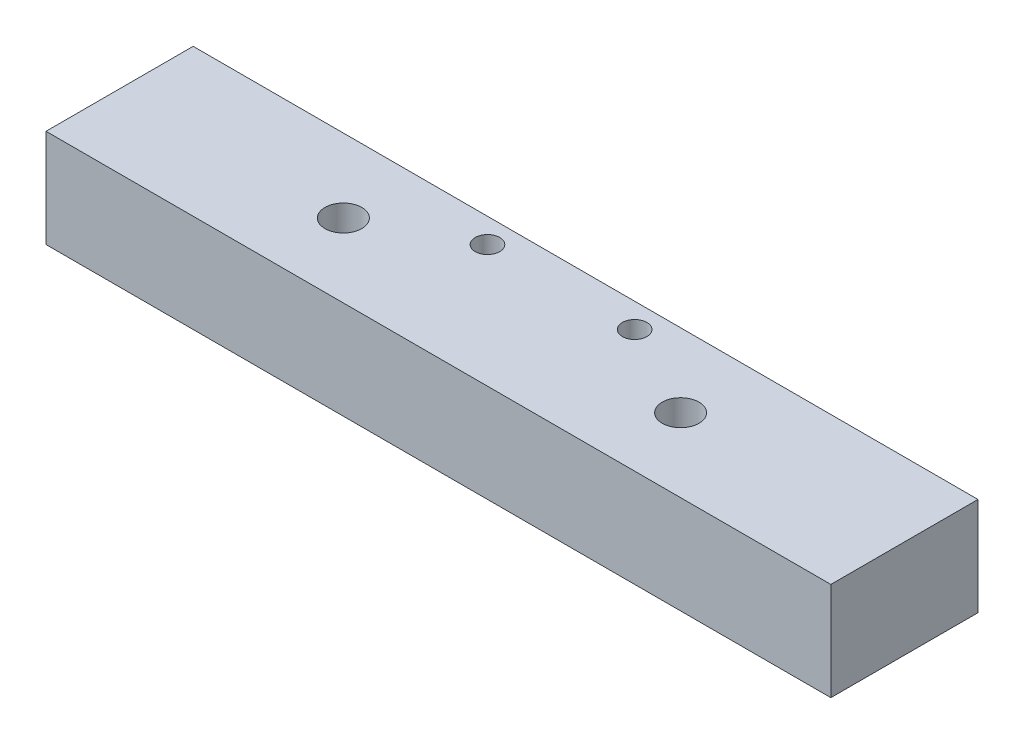
ISO-10303-21;
HEADER;
FILE_DESCRIPTION(('STEP AP214'),'2;1');
FILE_NAME('part.step','',(''),(''),'','','');
FILE_SCHEMA(('AUTOMOTIVE_DESIGN { 1 0 10303 214 1 1 1 1 }'));
ENDSEC;
DATA;
#1=APPLICATION_CONTEXT('core data for automotive mechanical design processes');
#2=APPLICATION_PROTOCOL_DEFINITION('international standard','automotive_design',2000,#1);
#3=PRODUCT_CONTEXT('',#1,'mechanical');
#4=PRODUCT('Part','Part','',(#3));
#5=PRODUCT_RELATED_PRODUCT_CATEGORY('part','',(#4));
#6=PRODUCT_DEFINITION_FORMATION('','',#4);
#7=PRODUCT_DEFINITION_CONTEXT('part definition',#1,'design');
#8=PRODUCT_DEFINITION('design','',#6,#7);
#9=PRODUCT_DEFINITION_SHAPE('','',#8);
#10=(LENGTH_UNIT() NAMED_UNIT(*) SI_UNIT(.MILLI.,.METRE.));
#11=(NAMED_UNIT(*) PLANE_ANGLE_UNIT() SI_UNIT($,.RADIAN.));
#12=(NAMED_UNIT(*) SI_UNIT($,.STERADIAN.) SOLID_ANGLE_UNIT());
#13=UNCERTAINTY_MEASURE_WITH_UNIT(LENGTH_MEASURE(1.E-05),#10,'distance_accuracy_value','');
#14=(GEOMETRIC_REPRESENTATION_CONTEXT(3) GLOBAL_UNCERTAINTY_ASSIGNED_CONTEXT((#13)) GLOBAL_UNIT_ASSIGNED_CONTEXT((#10,
#11,#12)) REPRESENTATION_CONTEXT('',''));
#15=CARTESIAN_POINT('',(0.,0.,0.));
#16=DIRECTION('',(0.,0.,1.));
#17=DIRECTION('',(1.,0.,0.));
#18=AXIS2_PLACEMENT_3D('',#15,#16,#17);
#19=CARTESIAN_POINT('',(203.2,50.8,38.1));
#20=DIRECTION('',(-1.,0.,0.));
#21=DIRECTION('',(0.,0.,1.));
#22=AXIS2_PLACEMENT_3D('',#19,#20,#21);
#23=PLANE('',#22);
#24=DIRECTION('',(0.,0.,-1.));
#25=VECTOR('',#24,1.);
#26=CARTESIAN_POINT('',(203.2,0.,38.1));
#27=LINE('',#26,#25);
#28=CARTESIAN_POINT('',(203.2,0.,38.1));
#29=VERTEX_POINT('',#28);
#30=CARTESIAN_POINT('',(203.2,0.,-38.1));
#31=VERTEX_POINT('',#30);
#32=EDGE_CURVE('E101',#29,#31,#27,.T.);
#33=ORIENTED_EDGE('',*,*,#32,.T.);
#34=DIRECTION('',(0.,-1.,0.));
#35=VECTOR('',#34,1.);
#36=CARTESIAN_POINT('',(203.2,50.8,-38.1));
#37=LINE('',#36,#35);
#38=CARTESIAN_POINT('',(203.2,50.8,-38.1));
#39=VERTEX_POINT('',#38);
#40=EDGE_CURVE('E11',#39,#31,#37,.T.);
#41=ORIENTED_EDGE('',*,*,#40,.F.);
#42=DIRECTION('',(0.,0.,-1.));
#43=VECTOR('',#42,1.);
#44=CARTESIAN_POINT('',(203.2,50.8,38.1));
#45=LINE('',#44,#43);
#46=CARTESIAN_POINT('',(203.2,50.8,38.1));
#47=VERTEX_POINT('',#46);
#48=EDGE_CURVE('E89',#47,#39,#45,.T.);
#49=ORIENTED_EDGE('',*,*,#48,.F.);
#50=DIRECTION('',(0.,-1.,0.));
#51=VECTOR('',#50,1.);
#52=CARTESIAN_POINT('',(203.2,50.8,38.1));
#53=LINE('',#52,#51);
#54=EDGE_CURVE('E97',#47,#29,#53,.T.);
#55=ORIENTED_EDGE('',*,*,#54,.T.);
#56=EDGE_LOOP('',(#33,#41,#49,#55));
#57=FACE_BOUND('',#56,.T.);
#58=ADVANCED_FACE('F38',(#57),#23,.F.);
#59=CARTESIAN_POINT('',(-203.2,50.8,-38.1));
#60=DIRECTION('',(0.,0.,1.));
#61=DIRECTION('',(1.,0.,0.));
#62=AXIS2_PLACEMENT_3D('',#59,#60,#61);
#63=PLANE('',#62);
#64=DIRECTION('',(-1.,0.,0.));
#65=VECTOR('',#64,1.);
#66=CARTESIAN_POINT('',(-203.2,0.,-38.1));
#67=LINE('',#66,#65);
#68=CARTESIAN_POINT('',(-203.2,0.,-38.1));
#69=VERTEX_POINT('',#68);
#70=EDGE_CURVE('E93',#31,#69,#67,.T.);
#71=ORIENTED_EDGE('',*,*,#70,.T.);
#72=DIRECTION('',(0.,-1.,0.));
#73=VECTOR('',#72,1.);
#74=CARTESIAN_POINT('',(-203.2,50.8,-38.1));
#75=LINE('',#74,#73);
#76=CARTESIAN_POINT('',(-203.2,50.8,-38.1));
#77=VERTEX_POINT('',#76);
#78=EDGE_CURVE('E46',#77,#69,#75,.T.);
#79=ORIENTED_EDGE('',*,*,#78,.F.);
#80=DIRECTION('',(-1.,0.,0.));
#81=VECTOR('',#80,1.);
#82=CARTESIAN_POINT('',(-203.2,50.8,-38.1));
#83=LINE('',#82,#81);
#84=EDGE_CURVE('E84',#39,#77,#83,.T.);
#85=ORIENTED_EDGE('',*,*,#84,.F.);
#86=ORIENTED_EDGE('',*,*,#40,.T.);
#87=EDGE_LOOP('',(#71,#79,#85,#86));
#88=FACE_BOUND('',#87,.T.);
#89=ADVANCED_FACE('F92',(#88),#63,.F.);
#90=CARTESIAN_POINT('',(-203.2,50.8,38.1));
#91=DIRECTION('',(1.,0.,0.));
#92=DIRECTION('',(0.,0.,-1.));
#93=AXIS2_PLACEMENT_3D('',#90,#91,#92);
#94=PLANE('',#93);
#95=DIRECTION('',(0.,0.,1.));
#96=VECTOR('',#95,1.);
#97=CARTESIAN_POINT('',(-203.2,0.,38.1));
#98=LINE('',#97,#96);
#99=CARTESIAN_POINT('',(-203.2,0.,38.1));
#100=VERTEX_POINT('',#99);
#101=EDGE_CURVE('E71',#69,#100,#98,.T.);
#102=ORIENTED_EDGE('',*,*,#101,.T.);
#103=DIRECTION('',(0.,-1.,0.));
#104=VECTOR('',#103,1.);
#105=CARTESIAN_POINT('',(-203.2,50.8,38.1));
#106=LINE('',#105,#104);
#107=CARTESIAN_POINT('',(-203.2,50.8,38.1));
#108=VERTEX_POINT('',#107);
#109=EDGE_CURVE('E94',#108,#100,#106,.T.);
#110=ORIENTED_EDGE('',*,*,#109,.F.);
#111=DIRECTION('',(0.,0.,1.));
#112=VECTOR('',#111,1.);
#113=CARTESIAN_POINT('',(-203.2,50.8,38.1));
#114=LINE('',#113,#112);
#115=EDGE_CURVE('E87',#77,#108,#114,.T.);
#116=ORIENTED_EDGE('',*,*,#115,.F.);
#117=ORIENTED_EDGE('',*,*,#78,.T.);
#118=EDGE_LOOP('',(#102,#110,#116,#117));
#119=FACE_BOUND('',#118,.T.);
#120=ADVANCED_FACE('F95',(#119),#94,.F.);
#121=CARTESIAN_POINT('',(-203.2,50.8,38.1));
#122=DIRECTION('',(0.,0.,-1.));
#123=DIRECTION('',(-1.,0.,0.));
#124=AXIS2_PLACEMENT_3D('',#121,#122,#123);
#125=PLANE('',#124);
#126=DIRECTION('',(1.,0.,0.));
#127=VECTOR('',#126,1.);
#128=CARTESIAN_POINT('',(-203.2,0.,38.1));
#129=LINE('',#128,#127);
#130=EDGE_CURVE('E77',#100,#29,#129,.T.);
#131=ORIENTED_EDGE('',*,*,#130,.T.);
#132=ORIENTED_EDGE('',*,*,#54,.F.);
#133=DIRECTION('',(1.,0.,0.));
#134=VECTOR('',#133,1.);
#135=CARTESIAN_POINT('',(-203.2,50.8,38.1));
#136=LINE('',#135,#134);
#137=EDGE_CURVE('E54',#108,#47,#136,.T.);
#138=ORIENTED_EDGE('',*,*,#137,.F.);
#139=ORIENTED_EDGE('',*,*,#109,.T.);
#140=EDGE_LOOP('',(#131,#132,#138,#139));
#141=FACE_BOUND('',#140,.T.);
#142=ADVANCED_FACE('F109',(#141),#125,.F.);
#143=CARTESIAN_POINT('',(0.,50.8,0.));
#144=DIRECTION('',(0.,-1.,0.));
#145=DIRECTION('',(0.,0.,-1.));
#146=AXIS2_PLACEMENT_3D('',#143,#144,#145);
#147=PLANE('',#146);
#148=CARTESIAN_POINT('',(-38.1,50.8,-25.4));
#149=DIRECTION('',(0.,-1.,0.));
#150=DIRECTION('',(0.,0.,1.));
#151=AXIS2_PLACEMENT_3D('',#148,#149,#150);
#152=CIRCLE('',#151,6.35);
#153=CARTESIAN_POINT('',(-38.1,50.8,-19.05));
#154=VERTEX_POINT('',#153);
#155=EDGE_CURVE('E133',#154,#154,#152,.T.);
#156=ORIENTED_EDGE('',*,*,#155,.T.);
#157=EDGE_LOOP('',(#156));
#158=FACE_BOUND('',#157,.T.);
#159=CARTESIAN_POINT('',(-87.3125,50.8,0.));
#160=DIRECTION('',(0.,-1.,0.));
#161=DIRECTION('',(0.,0.,1.));
#162=AXIS2_PLACEMENT_3D('',#159,#160,#161);
#163=CIRCLE('',#162,9.52500000000001);
#164=CARTESIAN_POINT('',(-87.3125,50.8,9.52500000000001));
#165=VERTEX_POINT('',#164);
#166=EDGE_CURVE('E127',#165,#165,#163,.T.);
#167=ORIENTED_EDGE('',*,*,#166,.T.);
#168=EDGE_LOOP('',(#167));
#169=FACE_BOUND('',#168,.T.);
#170=CARTESIAN_POINT('',(38.1,50.8,-25.4));
#171=DIRECTION('',(0.,1.,0.));
#172=DIRECTION('',(0.,0.,1.));
#173=AXIS2_PLACEMENT_3D('',#170,#171,#172);
#174=CIRCLE('',#173,6.35);
#175=CARTESIAN_POINT('',(38.1,50.8,-19.05));
#176=VERTEX_POINT('',#175);
#177=EDGE_CURVE('E121',#176,#176,#174,.T.);
#178=ORIENTED_EDGE('',*,*,#177,.F.);
#179=EDGE_LOOP('',(#178));
#180=FACE_BOUND('',#179,.T.);
#181=CARTESIAN_POINT('',(87.3125,50.8,0.));
#182=DIRECTION('',(0.,1.,0.));
#183=DIRECTION('',(0.,0.,1.));
#184=AXIS2_PLACEMENT_3D('',#181,#182,#183);
#185=CIRCLE('',#184,9.52500000000001);
#186=CARTESIAN_POINT('',(87.3125,50.8,9.52500000000001));
#187=VERTEX_POINT('',#186);
#188=EDGE_CURVE('E115',#187,#187,#185,.T.);
#189=ORIENTED_EDGE('',*,*,#188,.F.);
#190=EDGE_LOOP('',(#189));
#191=FACE_BOUND('',#190,.T.);
#192=ORIENTED_EDGE('',*,*,#48,.T.);
#193=ORIENTED_EDGE('',*,*,#84,.T.);
#194=ORIENTED_EDGE('',*,*,#115,.T.);
#195=ORIENTED_EDGE('',*,*,#137,.T.);
#196=EDGE_LOOP('',(#192,#193,#194,#195));
#197=FACE_BOUND('',#196,.T.);
#198=ADVANCED_FACE('F85',(#158,#169,#180,#191,#197),#147,.F.);
#199=CARTESIAN_POINT('',(0.,0.,0.));
#200=DIRECTION('',(0.,-1.,0.));
#201=DIRECTION('',(0.,0.,-1.));
#202=AXIS2_PLACEMENT_3D('',#199,#200,#201);
#203=PLANE('',#202);
#204=CARTESIAN_POINT('',(-87.3125,0.,0.));
#205=DIRECTION('',(0.,-1.,0.));
#206=DIRECTION('',(0.,0.,1.));
#207=AXIS2_PLACEMENT_3D('',#204,#205,#206);
#208=CIRCLE('',#207,9.52500000000001);
#209=CARTESIAN_POINT('',(-87.3125,0.,9.52500000000001));
#210=VERTEX_POINT('',#209);
#211=EDGE_CURVE('E124',#210,#210,#208,.T.);
#212=ORIENTED_EDGE('',*,*,#211,.F.);
#213=EDGE_LOOP('',(#212));
#214=FACE_BOUND('',#213,.T.);
#215=CARTESIAN_POINT('',(87.3125,0.,0.));
#216=DIRECTION('',(0.,1.,0.));
#217=DIRECTION('',(0.,0.,1.));
#218=AXIS2_PLACEMENT_3D('',#215,#216,#217);
#219=CIRCLE('',#218,9.52500000000001);
#220=CARTESIAN_POINT('',(87.3125,0.,9.52500000000001));
#221=VERTEX_POINT('',#220);
#222=EDGE_CURVE('E104',#221,#221,#219,.T.);
#223=ORIENTED_EDGE('',*,*,#222,.T.);
#224=EDGE_LOOP('',(#223));
#225=FACE_BOUND('',#224,.T.);
#226=ORIENTED_EDGE('',*,*,#32,.F.);
#227=ORIENTED_EDGE('',*,*,#130,.F.);
#228=ORIENTED_EDGE('',*,*,#101,.F.);
#229=ORIENTED_EDGE('',*,*,#70,.F.);
#230=EDGE_LOOP('',(#226,#227,#228,#229));
#231=FACE_BOUND('',#230,.T.);
#232=ADVANCED_FACE('F112',(#214,#225,#231),#203,.T.);
#233=CARTESIAN_POINT('',(87.3125,0.,0.));
#234=DIRECTION('',(0.,1.,0.));
#235=DIRECTION('',(0.,0.,1.));
#236=AXIS2_PLACEMENT_3D('',#233,#234,#235);
#237=CYLINDRICAL_SURFACE('',#236,9.52500000000001);
#238=ORIENTED_EDGE('',*,*,#222,.F.);
#239=EDGE_LOOP('',(#238));
#240=FACE_BOUND('',#239,.T.);
#241=ORIENTED_EDGE('',*,*,#188,.T.);
#242=EDGE_LOOP('',(#241));
#243=FACE_BOUND('',#242,.T.);
#244=ADVANCED_FACE('F163',(#240,#243),#237,.F.);
#245=CARTESIAN_POINT('',(38.1,41.91,-25.4));
#246=DIRECTION('',(0.,1.,0.));
#247=DIRECTION('',(0.,0.,1.));
#248=AXIS2_PLACEMENT_3D('',#245,#246,#247);
#249=CYLINDRICAL_SURFACE('',#248,6.35);
#250=CARTESIAN_POINT('',(38.1,41.91,-25.4));
#251=DIRECTION('',(0.,1.,0.));
#252=DIRECTION('',(0.,0.,1.));
#253=AXIS2_PLACEMENT_3D('',#250,#251,#252);
#254=CIRCLE('',#253,6.35);
#255=CARTESIAN_POINT('',(38.1,41.91,-19.05));
#256=VERTEX_POINT('',#255);
#257=EDGE_CURVE('E118',#256,#256,#254,.T.);
#258=ORIENTED_EDGE('',*,*,#257,.F.);
#259=EDGE_LOOP('',(#258));
#260=FACE_BOUND('',#259,.T.);
#261=ORIENTED_EDGE('',*,*,#177,.T.);
#262=EDGE_LOOP('',(#261));
#263=FACE_BOUND('',#262,.T.);
#264=ADVANCED_FACE('F170',(#260,#263),#249,.F.);
#265=CARTESIAN_POINT('',(38.1,41.91,-25.4));
#266=DIRECTION('',(0.,1.,0.));
#267=DIRECTION('',(0.,0.,1.));
#268=AXIS2_PLACEMENT_3D('',#265,#266,#267);
#269=PLANE('',#268);
#270=ORIENTED_EDGE('',*,*,#257,.T.);
#271=EDGE_LOOP('',(#270));
#272=FACE_BOUND('',#271,.T.);
#273=ADVANCED_FACE('F174',(#272),#269,.T.);
#274=CARTESIAN_POINT('',(-87.3125,0.,0.));
#275=DIRECTION('',(0.,1.,0.));
#276=DIRECTION('',(0.,0.,1.));
#277=AXIS2_PLACEMENT_3D('',#274,#275,#276);
#278=CYLINDRICAL_SURFACE('',#277,9.52500000000001);
#279=ORIENTED_EDGE('',*,*,#211,.T.);
#280=EDGE_LOOP('',(#279));
#281=FACE_BOUND('',#280,.T.);
#282=ORIENTED_EDGE('',*,*,#166,.F.);
#283=EDGE_LOOP('',(#282));
#284=FACE_BOUND('',#283,.T.);
#285=ADVANCED_FACE('F148',(#281,#284),#278,.F.);
#286=CARTESIAN_POINT('',(-38.1,41.91,-25.4));
#287=DIRECTION('',(0.,1.,0.));
#288=DIRECTION('',(0.,0.,1.));
#289=AXIS2_PLACEMENT_3D('',#286,#287,#288);
#290=CYLINDRICAL_SURFACE('',#289,6.35);
#291=CARTESIAN_POINT('',(-38.1,41.91,-25.4));
#292=DIRECTION('',(0.,-1.,0.));
#293=DIRECTION('',(0.,0.,1.));
#294=AXIS2_PLACEMENT_3D('',#291,#292,#293);
#295=CIRCLE('',#294,6.35);
#296=CARTESIAN_POINT('',(-38.1,41.91,-19.05));
#297=VERTEX_POINT('',#296);
#298=EDGE_CURVE('E130',#297,#297,#295,.T.);
#299=ORIENTED_EDGE('',*,*,#298,.T.);
#300=EDGE_LOOP('',(#299));
#301=FACE_BOUND('',#300,.T.);
#302=ORIENTED_EDGE('',*,*,#155,.F.);
#303=EDGE_LOOP('',(#302));
#304=FACE_BOUND('',#303,.T.);
#305=ADVANCED_FACE('F139',(#301,#304),#290,.F.);
#306=CARTESIAN_POINT('',(-38.1,41.91,-25.4));
#307=DIRECTION('',(0.,1.,0.));
#308=DIRECTION('',(0.,0.,1.));
#309=AXIS2_PLACEMENT_3D('',#306,#307,#308);
#310=PLANE('',#309);
#311=ORIENTED_EDGE('',*,*,#298,.F.);
#312=EDGE_LOOP('',(#311));
#313=FACE_BOUND('',#312,.T.);
#314=ADVANCED_FACE('F142',(#313),#310,.T.);
#315=CLOSED_SHELL('',(#58,#89,#120,#142,#198,#232,#244,#264,#273,#285,#305,#314));
#316=MANIFOLD_SOLID_BREP('B2',#315);
#317=ADVANCED_BREP_SHAPE_REPRESENTATION('',(#18,#316),#14);
#318=SHAPE_DEFINITION_REPRESENTATION(#9,#317);
ENDSEC;
END-ISO-10303-21;
